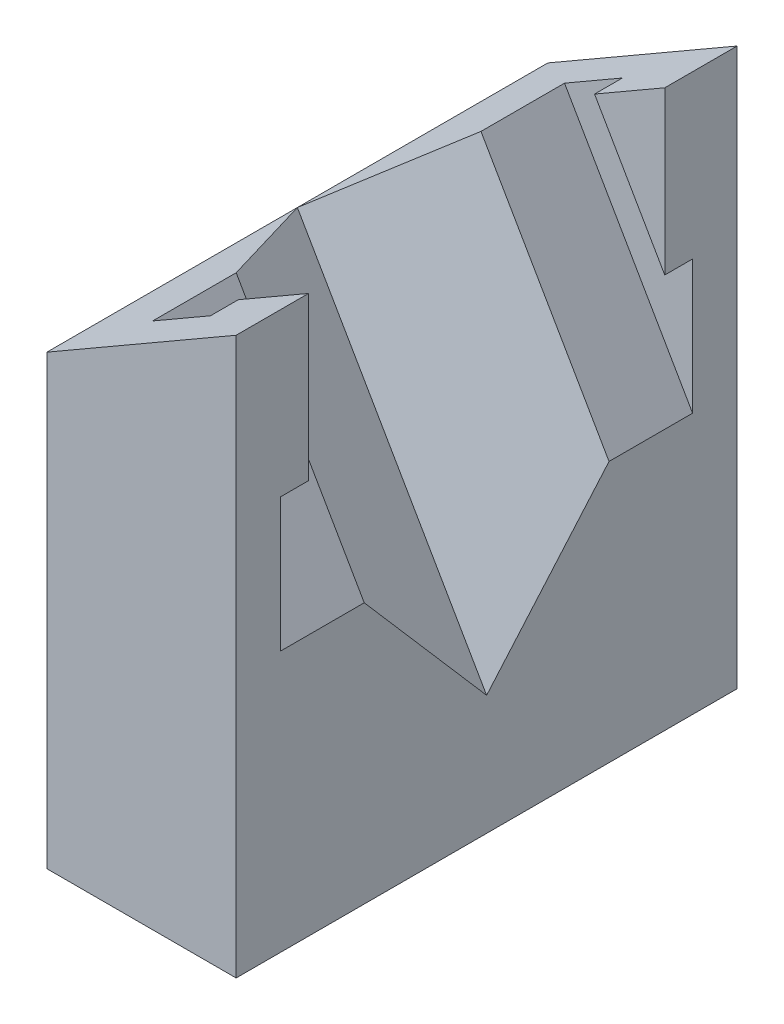
ISO-10303-21;
HEADER;
FILE_DESCRIPTION(('STEP AP214'),'2;1');
FILE_NAME('part.step','',(''),(''),'','','');
FILE_SCHEMA(('AUTOMOTIVE_DESIGN { 1 0 10303 214 1 1 1 1 }'));
ENDSEC;
DATA;
#1=APPLICATION_CONTEXT('core data for automotive mechanical design processes');
#2=APPLICATION_PROTOCOL_DEFINITION('international standard','automotive_design',2000,#1);
#3=PRODUCT_CONTEXT('',#1,'mechanical');
#4=PRODUCT('Part','Part','',(#3));
#5=PRODUCT_RELATED_PRODUCT_CATEGORY('part','',(#4));
#6=PRODUCT_DEFINITION_FORMATION('','',#4);
#7=PRODUCT_DEFINITION_CONTEXT('part definition',#1,'design');
#8=PRODUCT_DEFINITION('design','',#6,#7);
#9=PRODUCT_DEFINITION_SHAPE('','',#8);
#10=(LENGTH_UNIT() NAMED_UNIT(*) SI_UNIT(.MILLI.,.METRE.));
#11=(NAMED_UNIT(*) PLANE_ANGLE_UNIT() SI_UNIT($,.RADIAN.));
#12=(NAMED_UNIT(*) SI_UNIT($,.STERADIAN.) SOLID_ANGLE_UNIT());
#13=UNCERTAINTY_MEASURE_WITH_UNIT(LENGTH_MEASURE(1.E-05),#10,'distance_accuracy_value','');
#14=(GEOMETRIC_REPRESENTATION_CONTEXT(3) GLOBAL_UNCERTAINTY_ASSIGNED_CONTEXT((#13)) GLOBAL_UNIT_ASSIGNED_CONTEXT((#10,
#11,#12)) REPRESENTATION_CONTEXT('',''));
#15=CARTESIAN_POINT('',(0.,0.,0.));
#16=DIRECTION('',(0.,0.,1.));
#17=DIRECTION('',(1.,0.,0.));
#18=AXIS2_PLACEMENT_3D('',#15,#16,#17);
#19=CARTESIAN_POINT('',(8.5,50.,-22.5));
#20=DIRECTION('',(0.499999999999995,-0.866025403784442,0.));
#21=DIRECTION('',(0.866025403784442,0.499999999999995,0.));
#22=AXIS2_PLACEMENT_3D('',#19,#20,#21);
#23=PLANE('',#22);
#24=DIRECTION('',(0.,0.,-1.));
#25=VECTOR('',#24,1.);
#26=CARTESIAN_POINT('',(2.19333900576964,46.3588475772935,-18.5));
#27=LINE('',#26,#25);
#28=CARTESIAN_POINT('',(2.19333900576964,46.3588475772935,-16.));
#29=VERTEX_POINT('',#28);
#30=CARTESIAN_POINT('',(2.19333900576964,46.3588475772935,-18.5));
#31=VERTEX_POINT('',#30);
#32=EDGE_CURVE('E249',#29,#31,#27,.T.);
#33=ORIENTED_EDGE('',*,*,#32,.F.);
#34=DIRECTION('',(0.866025403784442,0.499999999999995,0.));
#35=VECTOR('',#34,1.);
#36=CARTESIAN_POINT('',(8.50000000000001,50.,-16.));
#37=LINE('',#36,#35);
#38=CARTESIAN_POINT('',(8.49999999999999,50.,-16.));
#39=VERTEX_POINT('',#38);
#40=EDGE_CURVE('E11',#29,#39,#37,.T.);
#41=ORIENTED_EDGE('',*,*,#40,.T.);
#42=DIRECTION('',(0.,0.,-1.));
#43=VECTOR('',#42,1.);
#44=CARTESIAN_POINT('',(8.5,50.,22.5));
#45=LINE('',#44,#43);
#46=CARTESIAN_POINT('',(8.5,50.,-22.5));
#47=VERTEX_POINT('',#46);
#48=EDGE_CURVE('E119',#39,#47,#45,.T.);
#49=ORIENTED_EDGE('',*,*,#48,.T.);
#50=DIRECTION('',(0.866025403784442,0.499999999999995,0.));
#51=VECTOR('',#50,1.);
#52=CARTESIAN_POINT('',(8.5,50.,-22.5));
#53=LINE('',#52,#51);
#54=CARTESIAN_POINT('',(-8.5,40.1850454237765,-22.5));
#55=VERTEX_POINT('',#54);
#56=EDGE_CURVE('E111',#55,#47,#53,.T.);
#57=ORIENTED_EDGE('',*,*,#56,.F.);
#58=DIRECTION('',(0.,0.,1.));
#59=VECTOR('',#58,1.);
#60=CARTESIAN_POINT('',(-8.5,40.1850454237765,-22.5));
#61=LINE('',#60,#59);
#62=CARTESIAN_POINT('',(-8.50000000000001,40.1850454237765,0.));
#63=VERTEX_POINT('',#62);
#64=EDGE_CURVE('E139',#55,#63,#61,.T.);
#65=ORIENTED_EDGE('',*,*,#64,.T.);
#66=DIRECTION('',(-0.433012701892222,-0.249999999999998,0.866025403784438));
#67=VECTOR('',#66,1.);
#68=CARTESIAN_POINT('',(-3.00281341693702,43.3588475772935,-10.9943731661259));
#69=LINE('',#68,#67);
#70=CARTESIAN_POINT('',(-3.00281341693702,43.3588475772935,-10.9943731661259));
#71=VERTEX_POINT('',#70);
#72=EDGE_CURVE('E237',#71,#63,#69,.T.);
#73=ORIENTED_EDGE('',*,*,#72,.F.);
#74=DIRECTION('',(0.,0.,1.));
#75=VECTOR('',#74,1.);
#76=CARTESIAN_POINT('',(-3.00281341693702,43.3588475772935,-18.5));
#77=LINE('',#76,#75);
#78=CARTESIAN_POINT('',(-3.00281341693702,43.3588475772935,-18.5));
#79=VERTEX_POINT('',#78);
#80=EDGE_CURVE('E241',#79,#71,#77,.T.);
#81=ORIENTED_EDGE('',*,*,#80,.F.);
#82=DIRECTION('',(-0.866025403784442,-0.499999999999994,0.));
#83=VECTOR('',#82,1.);
#84=CARTESIAN_POINT('',(2.19333900576964,46.3588475772935,-18.5));
#85=LINE('',#84,#83);
#86=EDGE_CURVE('E245',#31,#79,#85,.T.);
#87=ORIENTED_EDGE('',*,*,#86,.F.);
#88=EDGE_LOOP('',(#33,#41,#49,#57,#65,#73,#81,#87));
#89=FACE_BOUND('',#88,.T.);
#90=ADVANCED_FACE('F45',(#89),#23,.F.);
#91=CARTESIAN_POINT('',(-8.5,50.,22.5));
#92=DIRECTION('',(1.,0.,0.));
#93=DIRECTION('',(0.,0.,-1.));
#94=AXIS2_PLACEMENT_3D('',#91,#92,#93);
#95=PLANE('',#94);
#96=DIRECTION('',(0.,-1.,0.));
#97=VECTOR('',#96,1.);
#98=CARTESIAN_POINT('',(-8.5,50.,22.5));
#99=LINE('',#98,#97);
#100=CARTESIAN_POINT('',(-8.5,40.1850454237765,22.5));
#101=VERTEX_POINT('',#100);
#102=CARTESIAN_POINT('',(-8.5,0.,22.5));
#103=VERTEX_POINT('',#102);
#104=EDGE_CURVE('E54',#101,#103,#99,.T.);
#105=ORIENTED_EDGE('',*,*,#104,.F.);
#106=EDGE_CURVE('E143',#63,#101,#61,.T.);
#107=ORIENTED_EDGE('',*,*,#106,.F.);
#108=ORIENTED_EDGE('',*,*,#64,.F.);
#109=DIRECTION('',(0.,-1.,0.));
#110=VECTOR('',#109,1.);
#111=CARTESIAN_POINT('',(-8.5,50.,-22.5));
#112=LINE('',#111,#110);
#113=CARTESIAN_POINT('',(-8.5,0.,-22.5));
#114=VERTEX_POINT('',#113);
#115=EDGE_CURVE('E113',#55,#114,#112,.T.);
#116=ORIENTED_EDGE('',*,*,#115,.T.);
#117=DIRECTION('',(0.,0.,1.));
#118=VECTOR('',#117,1.);
#119=CARTESIAN_POINT('',(-8.5,0.,22.5));
#120=LINE('',#119,#118);
#121=EDGE_CURVE('E117',#114,#103,#120,.T.);
#122=ORIENTED_EDGE('',*,*,#121,.T.);
#123=EDGE_LOOP('',(#105,#107,#108,#116,#122));
#124=FACE_BOUND('',#123,.T.);
#125=ADVANCED_FACE('F47',(#124),#95,.F.);
#126=CARTESIAN_POINT('',(8.5,50.,22.5));
#127=DIRECTION('',(0.,0.,-1.));
#128=DIRECTION('',(-1.,0.,0.));
#129=AXIS2_PLACEMENT_3D('',#126,#127,#128);
#130=PLANE('',#129);
#131=DIRECTION('',(0.,-1.,0.));
#132=VECTOR('',#131,1.);
#133=CARTESIAN_POINT('',(8.5,50.,22.5));
#134=LINE('',#133,#132);
#135=CARTESIAN_POINT('',(8.5,50.,22.5));
#136=VERTEX_POINT('',#135);
#137=CARTESIAN_POINT('',(8.5,0.,22.5));
#138=VERTEX_POINT('',#137);
#139=EDGE_CURVE('E96',#136,#138,#134,.T.);
#140=ORIENTED_EDGE('',*,*,#139,.F.);
#141=DIRECTION('',(0.866025403784442,0.499999999999995,0.));
#142=VECTOR('',#141,1.);
#143=CARTESIAN_POINT('',(8.5,50.,22.5));
#144=LINE('',#143,#142);
#145=EDGE_CURVE('E70',#101,#136,#144,.T.);
#146=ORIENTED_EDGE('',*,*,#145,.F.);
#147=ORIENTED_EDGE('',*,*,#104,.T.);
#148=DIRECTION('',(1.,0.,0.));
#149=VECTOR('',#148,1.);
#150=CARTESIAN_POINT('',(8.5,0.,22.5));
#151=LINE('',#150,#149);
#152=EDGE_CURVE('E102',#103,#138,#151,.T.);
#153=ORIENTED_EDGE('',*,*,#152,.T.);
#154=EDGE_LOOP('',(#140,#146,#147,#153));
#155=FACE_BOUND('',#154,.T.);
#156=ADVANCED_FACE('F133',(#155),#130,.F.);
#157=CARTESIAN_POINT('',(8.5,50.,22.5));
#158=DIRECTION('',(-1.,0.,0.));
#159=DIRECTION('',(0.,0.,1.));
#160=AXIS2_PLACEMENT_3D('',#157,#158,#159);
#161=PLANE('',#160);
#162=ORIENTED_EDGE('',*,*,#48,.F.);
#163=DIRECTION('',(0.,-1.,0.));
#164=VECTOR('',#163,1.);
#165=CARTESIAN_POINT('',(8.5,50.,-16.));
#166=LINE('',#165,#164);
#167=CARTESIAN_POINT('',(8.5,35.4353903091735,-16.));
#168=VERTEX_POINT('',#167);
#169=EDGE_CURVE('E183',#39,#168,#166,.T.);
#170=ORIENTED_EDGE('',*,*,#169,.T.);
#171=DIRECTION('',(0.,0.,-1.));
#172=VECTOR('',#171,1.);
#173=CARTESIAN_POINT('',(8.5,35.4353903091735,22.5));
#174=LINE('',#173,#172);
#175=CARTESIAN_POINT('',(8.5,35.4353903091735,-18.5));
#176=VERTEX_POINT('',#175);
#177=EDGE_CURVE('E179',#168,#176,#174,.T.);
#178=ORIENTED_EDGE('',*,*,#177,.T.);
#179=DIRECTION('',(0.,-1.,0.));
#180=VECTOR('',#179,1.);
#181=CARTESIAN_POINT('',(8.5,50.,-18.5));
#182=LINE('',#181,#180);
#183=CARTESIAN_POINT('',(8.5,23.4353903091733,-18.5));
#184=VERTEX_POINT('',#183);
#185=EDGE_CURVE('E175',#176,#184,#182,.T.);
#186=ORIENTED_EDGE('',*,*,#185,.T.);
#187=DIRECTION('',(0.,0.,1.));
#188=VECTOR('',#187,1.);
#189=CARTESIAN_POINT('',(8.5,23.4353903091733,22.5));
#190=LINE('',#189,#188);
#191=CARTESIAN_POINT('',(8.5,23.4353903091733,-10.9943731661259));
#192=VERTEX_POINT('',#191);
#193=EDGE_CURVE('E171',#184,#192,#190,.T.);
#194=ORIENTED_EDGE('',*,*,#193,.T.);
#195=DIRECTION('',(0.,-0.755928946018459,0.654653670707972));
#196=VECTOR('',#195,1.);
#197=CARTESIAN_POINT('',(8.5,22.0397512492454,-9.78571428571453));
#198=LINE('',#197,#196);
#199=CARTESIAN_POINT('',(8.5,10.7401816951052,0.));
#200=VERTEX_POINT('',#199);
#201=EDGE_CURVE('E167',#192,#200,#198,.T.);
#202=ORIENTED_EDGE('',*,*,#201,.T.);
#203=DIRECTION('',(0.,0.755928946018458,0.654653670707973));
#204=VECTOR('',#203,1.);
#205=CARTESIAN_POINT('',(8.5,44.3089759179881,29.0714285714285));
#206=LINE('',#205,#204);
#207=CARTESIAN_POINT('',(8.5,23.4353903091733,10.9943731661259));
#208=VERTEX_POINT('',#207);
#209=EDGE_CURVE('E163',#200,#208,#206,.T.);
#210=ORIENTED_EDGE('',*,*,#209,.T.);
#211=DIRECTION('',(0.,0.,1.));
#212=VECTOR('',#211,1.);
#213=CARTESIAN_POINT('',(8.5,23.4353903091733,22.5));
#214=LINE('',#213,#212);
#215=CARTESIAN_POINT('',(8.5,23.4353903091733,18.5));
#216=VERTEX_POINT('',#215);
#217=EDGE_CURVE('E159',#208,#216,#214,.T.);
#218=ORIENTED_EDGE('',*,*,#217,.T.);
#219=DIRECTION('',(0.,1.,0.));
#220=VECTOR('',#219,1.);
#221=CARTESIAN_POINT('',(8.5,50.,18.5));
#222=LINE('',#221,#220);
#223=CARTESIAN_POINT('',(8.5,35.4353903091735,18.5));
#224=VERTEX_POINT('',#223);
#225=EDGE_CURVE('E155',#216,#224,#222,.T.);
#226=ORIENTED_EDGE('',*,*,#225,.T.);
#227=DIRECTION('',(0.,0.,-1.));
#228=VECTOR('',#227,1.);
#229=CARTESIAN_POINT('',(8.5,35.4353903091735,22.5));
#230=LINE('',#229,#228);
#231=CARTESIAN_POINT('',(8.5,35.4353903091735,16.));
#232=VERTEX_POINT('',#231);
#233=EDGE_CURVE('E149',#224,#232,#230,.T.);
#234=ORIENTED_EDGE('',*,*,#233,.T.);
#235=DIRECTION('',(0.,1.,0.));
#236=VECTOR('',#235,1.);
#237=CARTESIAN_POINT('',(8.5,50.,16.));
#238=LINE('',#237,#236);
#239=CARTESIAN_POINT('',(8.49999999999999,50.,16.));
#240=VERTEX_POINT('',#239);
#241=EDGE_CURVE('E187',#232,#240,#238,.T.);
#242=ORIENTED_EDGE('',*,*,#241,.T.);
#243=EDGE_CURVE('E123',#136,#240,#45,.T.);
#244=ORIENTED_EDGE('',*,*,#243,.F.);
#245=ORIENTED_EDGE('',*,*,#139,.T.);
#246=DIRECTION('',(0.,0.,-1.));
#247=VECTOR('',#246,1.);
#248=CARTESIAN_POINT('',(8.5,0.,22.5));
#249=LINE('',#248,#247);
#250=CARTESIAN_POINT('',(8.5,0.,-22.5));
#251=VERTEX_POINT('',#250);
#252=EDGE_CURVE('E90',#138,#251,#249,.T.);
#253=ORIENTED_EDGE('',*,*,#252,.T.);
#254=DIRECTION('',(0.,-1.,0.));
#255=VECTOR('',#254,1.);
#256=CARTESIAN_POINT('',(8.5,50.,-22.5));
#257=LINE('',#256,#255);
#258=EDGE_CURVE('E94',#47,#251,#257,.T.);
#259=ORIENTED_EDGE('',*,*,#258,.F.);
#260=EDGE_LOOP('',(#162,#170,#178,#186,#194,#202,#210,#218,#226,#234,#242,#244,#245,#253,#259));
#261=FACE_BOUND('',#260,.T.);
#262=ADVANCED_FACE('F93',(#261),#161,.F.);
#263=CARTESIAN_POINT('',(8.5,50.,-22.5));
#264=DIRECTION('',(0.,0.,1.));
#265=DIRECTION('',(1.,0.,0.));
#266=AXIS2_PLACEMENT_3D('',#263,#264,#265);
#267=PLANE('',#266);
#268=ORIENTED_EDGE('',*,*,#115,.F.);
#269=ORIENTED_EDGE('',*,*,#56,.T.);
#270=ORIENTED_EDGE('',*,*,#258,.T.);
#271=DIRECTION('',(-1.,0.,0.));
#272=VECTOR('',#271,1.);
#273=CARTESIAN_POINT('',(8.5,0.,-22.5));
#274=LINE('',#273,#272);
#275=EDGE_CURVE('E101',#251,#114,#274,.T.);
#276=ORIENTED_EDGE('',*,*,#275,.T.);
#277=EDGE_LOOP('',(#268,#269,#270,#276));
#278=FACE_BOUND('',#277,.T.);
#279=ADVANCED_FACE('F108',(#278),#267,.F.);
#280=CARTESIAN_POINT('',(0.,0.,0.));
#281=DIRECTION('',(0.,1.,0.));
#282=DIRECTION('',(0.,0.,1.));
#283=AXIS2_PLACEMENT_3D('',#280,#281,#282);
#284=PLANE('',#283);
#285=ORIENTED_EDGE('',*,*,#121,.F.);
#286=ORIENTED_EDGE('',*,*,#275,.F.);
#287=ORIENTED_EDGE('',*,*,#252,.F.);
#288=ORIENTED_EDGE('',*,*,#152,.F.);
#289=EDGE_LOOP('',(#285,#286,#287,#288));
#290=FACE_BOUND('',#289,.T.);
#291=ADVANCED_FACE('F115',(#290),#284,.F.);
#292=DIRECTION('',(0.,0.,1.));
#293=VECTOR('',#292,1.);
#294=CARTESIAN_POINT('',(-3.00281341693702,43.3588475772935,18.5));
#295=LINE('',#294,#293);
#296=CARTESIAN_POINT('',(-3.00281341693702,43.3588475772935,10.9943731661259));
#297=VERTEX_POINT('',#296);
#298=CARTESIAN_POINT('',(-3.00281341693702,43.3588475772935,18.5));
#299=VERTEX_POINT('',#298);
#300=EDGE_CURVE('E229',#297,#299,#295,.T.);
#301=ORIENTED_EDGE('',*,*,#300,.F.);
#302=DIRECTION('',(0.433012701892221,0.249999999999998,0.866025403784438));
#303=VECTOR('',#302,1.);
#304=CARTESIAN_POINT('',(-8.50000000000001,40.1850454237765,0.));
#305=LINE('',#304,#303);
#306=EDGE_CURVE('E233',#63,#297,#305,.T.);
#307=ORIENTED_EDGE('',*,*,#306,.F.);
#308=ORIENTED_EDGE('',*,*,#106,.T.);
#309=ORIENTED_EDGE('',*,*,#145,.T.);
#310=ORIENTED_EDGE('',*,*,#243,.T.);
#311=DIRECTION('',(0.866025403784442,0.499999999999995,0.));
#312=VECTOR('',#311,1.);
#313=CARTESIAN_POINT('',(2.19333900576964,46.3588475772935,16.));
#314=LINE('',#313,#312);
#315=CARTESIAN_POINT('',(2.19333900576964,46.3588475772934,16.));
#316=VERTEX_POINT('',#315);
#317=EDGE_CURVE('E253',#316,#240,#314,.T.);
#318=ORIENTED_EDGE('',*,*,#317,.F.);
#319=DIRECTION('',(0.,0.,-1.));
#320=VECTOR('',#319,1.);
#321=CARTESIAN_POINT('',(2.19333900576964,46.3588475772935,18.5));
#322=LINE('',#321,#320);
#323=CARTESIAN_POINT('',(2.19333900576964,46.3588475772935,18.5));
#324=VERTEX_POINT('',#323);
#325=EDGE_CURVE('E61',#324,#316,#322,.T.);
#326=ORIENTED_EDGE('',*,*,#325,.F.);
#327=DIRECTION('',(0.866025403784442,0.499999999999994,0.));
#328=VECTOR('',#327,1.);
#329=CARTESIAN_POINT('',(2.19333900576964,46.3588475772935,18.5));
#330=LINE('',#329,#328);
#331=EDGE_CURVE('E196',#299,#324,#330,.T.);
#332=ORIENTED_EDGE('',*,*,#331,.F.);
#333=EDGE_LOOP('',(#301,#307,#308,#309,#310,#318,#326,#332));
#334=FACE_BOUND('',#333,.T.);
#335=ADVANCED_FACE('F261',(#334),#23,.F.);
#336=CARTESIAN_POINT('',(23.8439741003805,8.85884757729317,18.5));
#337=DIRECTION('',(0.866025403784442,0.499999999999995,0.));
#338=DIRECTION('',(-0.499999999999995,0.866025403784442,0.));
#339=AXIS2_PLACEMENT_3D('',#336,#337,#338);
#340=PLANE('',#339);
#341=DIRECTION('',(-0.499999999999995,0.866025403784442,0.));
#342=VECTOR('',#341,1.);
#343=CARTESIAN_POINT('',(23.8439741003805,8.85884757729317,18.5));
#344=LINE('',#343,#342);
#345=EDGE_CURVE('E191',#224,#324,#344,.T.);
#346=ORIENTED_EDGE('',*,*,#345,.T.);
#347=ORIENTED_EDGE('',*,*,#325,.T.);
#348=DIRECTION('',(-0.499999999999995,0.866025403784442,0.));
#349=VECTOR('',#348,1.);
#350=CARTESIAN_POINT('',(23.8439741003805,8.85884757729317,16.));
#351=LINE('',#350,#349);
#352=EDGE_CURVE('E192',#232,#316,#351,.T.);
#353=ORIENTED_EDGE('',*,*,#352,.F.);
#354=ORIENTED_EDGE('',*,*,#233,.F.);
#355=EDGE_LOOP('',(#346,#347,#353,#354));
#356=FACE_BOUND('',#355,.T.);
#357=ADVANCED_FACE('F343',(#356),#340,.F.);
#358=CARTESIAN_POINT('',(23.8439741003805,8.85884757729317,18.5));
#359=DIRECTION('',(0.,0.,1.));
#360=DIRECTION('',(1.,0.,0.));
#361=AXIS2_PLACEMENT_3D('',#358,#359,#360);
#362=PLANE('',#361);
#363=DIRECTION('',(-0.499999999999995,0.866025403784442,0.));
#364=VECTOR('',#363,1.);
#365=CARTESIAN_POINT('',(18.6478216776738,5.85884757729321,18.5));
#366=LINE('',#365,#364);
#367=EDGE_CURVE('E220',#216,#299,#366,.T.);
#368=ORIENTED_EDGE('',*,*,#367,.T.);
#369=ORIENTED_EDGE('',*,*,#331,.T.);
#370=ORIENTED_EDGE('',*,*,#345,.F.);
#371=ORIENTED_EDGE('',*,*,#225,.F.);
#372=EDGE_LOOP('',(#368,#369,#370,#371));
#373=FACE_BOUND('',#372,.T.);
#374=ADVANCED_FACE('F341',(#373),#362,.F.);
#375=CARTESIAN_POINT('',(18.6478216776738,5.85884757729321,18.5));
#376=DIRECTION('',(-0.866025403784442,-0.499999999999995,0.));
#377=DIRECTION('',(0.499999999999995,-0.866025403784442,0.));
#378=AXIS2_PLACEMENT_3D('',#375,#376,#377);
#379=PLANE('',#378);
#380=DIRECTION('',(-0.499999999999995,0.866025403784442,0.));
#381=VECTOR('',#380,1.);
#382=CARTESIAN_POINT('',(18.6478216776738,5.85884757729321,10.9943731661259));
#383=LINE('',#382,#381);
#384=EDGE_CURVE('E216',#208,#297,#383,.T.);
#385=ORIENTED_EDGE('',*,*,#384,.T.);
#386=ORIENTED_EDGE('',*,*,#300,.T.);
#387=ORIENTED_EDGE('',*,*,#367,.F.);
#388=ORIENTED_EDGE('',*,*,#217,.F.);
#389=EDGE_LOOP('',(#385,#386,#387,#388));
#390=FACE_BOUND('',#389,.T.);
#391=ADVANCED_FACE('F338',(#390),#379,.F.);
#392=CARTESIAN_POINT('',(13.1506350946108,2.68504542377623,0.));
#393=DIRECTION('',(-0.750000000000002,-0.433012701892215,0.5));
#394=DIRECTION('',(0.554700196225228,0.,0.832050294337844));
#395=AXIS2_PLACEMENT_3D('',#392,#393,#394);
#396=PLANE('',#395);
#397=DIRECTION('',(-0.499999999999995,0.866025403784442,0.));
#398=VECTOR('',#397,1.);
#399=CARTESIAN_POINT('',(13.1506350946108,2.68504542377623,0.));
#400=LINE('',#399,#398);
#401=EDGE_CURVE('E212',#200,#63,#400,.T.);
#402=ORIENTED_EDGE('',*,*,#401,.T.);
#403=ORIENTED_EDGE('',*,*,#306,.T.);
#404=ORIENTED_EDGE('',*,*,#384,.F.);
#405=ORIENTED_EDGE('',*,*,#209,.F.);
#406=EDGE_LOOP('',(#402,#403,#404,#405));
#407=FACE_BOUND('',#406,.T.);
#408=ADVANCED_FACE('F334',(#407),#396,.F.);
#409=CARTESIAN_POINT('',(18.6478216776738,5.85884757729321,-10.9943731661259));
#410=DIRECTION('',(-0.750000000000002,-0.433012701892215,-0.500000000000001));
#411=DIRECTION('',(-0.554700196225229,0.,0.832050294337844));
#412=AXIS2_PLACEMENT_3D('',#409,#410,#411);
#413=PLANE('',#412);
#414=DIRECTION('',(-0.499999999999995,0.866025403784442,0.));
#415=VECTOR('',#414,1.);
#416=CARTESIAN_POINT('',(18.6478216776738,5.85884757729321,-10.9943731661259));
#417=LINE('',#416,#415);
#418=EDGE_CURVE('E208',#192,#71,#417,.T.);
#419=ORIENTED_EDGE('',*,*,#418,.T.);
#420=ORIENTED_EDGE('',*,*,#72,.T.);
#421=ORIENTED_EDGE('',*,*,#401,.F.);
#422=ORIENTED_EDGE('',*,*,#201,.F.);
#423=EDGE_LOOP('',(#419,#420,#421,#422));
#424=FACE_BOUND('',#423,.T.);
#425=ADVANCED_FACE('F331',(#424),#413,.F.);
#426=CARTESIAN_POINT('',(18.6478216776738,5.85884757729321,-18.5));
#427=DIRECTION('',(-0.866025403784442,-0.499999999999995,0.));
#428=DIRECTION('',(0.499999999999995,-0.866025403784442,0.));
#429=AXIS2_PLACEMENT_3D('',#426,#427,#428);
#430=PLANE('',#429);
#431=DIRECTION('',(-0.499999999999995,0.866025403784442,0.));
#432=VECTOR('',#431,1.);
#433=CARTESIAN_POINT('',(18.6478216776738,5.85884757729321,-18.5));
#434=LINE('',#433,#432);
#435=EDGE_CURVE('E204',#184,#79,#434,.T.);
#436=ORIENTED_EDGE('',*,*,#435,.T.);
#437=ORIENTED_EDGE('',*,*,#80,.T.);
#438=ORIENTED_EDGE('',*,*,#418,.F.);
#439=ORIENTED_EDGE('',*,*,#193,.F.);
#440=EDGE_LOOP('',(#436,#437,#438,#439));
#441=FACE_BOUND('',#440,.T.);
#442=ADVANCED_FACE('F329',(#441),#430,.F.);
#443=CARTESIAN_POINT('',(23.8439741003805,8.85884757729317,-18.5));
#444=DIRECTION('',(0.,0.,-1.));
#445=DIRECTION('',(-1.,0.,0.));
#446=AXIS2_PLACEMENT_3D('',#443,#444,#445);
#447=PLANE('',#446);
#448=DIRECTION('',(-0.499999999999995,0.866025403784442,0.));
#449=VECTOR('',#448,1.);
#450=CARTESIAN_POINT('',(23.8439741003805,8.85884757729317,-18.5));
#451=LINE('',#450,#449);
#452=EDGE_CURVE('E200',#176,#31,#451,.T.);
#453=ORIENTED_EDGE('',*,*,#452,.T.);
#454=ORIENTED_EDGE('',*,*,#86,.T.);
#455=ORIENTED_EDGE('',*,*,#435,.F.);
#456=ORIENTED_EDGE('',*,*,#185,.F.);
#457=EDGE_LOOP('',(#453,#454,#455,#456));
#458=FACE_BOUND('',#457,.T.);
#459=ADVANCED_FACE('F326',(#458),#447,.F.);
#460=CARTESIAN_POINT('',(23.8439741003805,8.85884757729317,-18.5));
#461=DIRECTION('',(0.866025403784442,0.499999999999995,0.));
#462=DIRECTION('',(-0.499999999999995,0.866025403784442,0.));
#463=AXIS2_PLACEMENT_3D('',#460,#461,#462);
#464=PLANE('',#463);
#465=DIRECTION('',(-0.499999999999995,0.866025403784442,0.));
#466=VECTOR('',#465,1.);
#467=CARTESIAN_POINT('',(23.8439741003805,8.85884757729317,-16.));
#468=LINE('',#467,#466);
#469=EDGE_CURVE('E195',#168,#29,#468,.T.);
#470=ORIENTED_EDGE('',*,*,#469,.T.);
#471=ORIENTED_EDGE('',*,*,#32,.T.);
#472=ORIENTED_EDGE('',*,*,#452,.F.);
#473=ORIENTED_EDGE('',*,*,#177,.F.);
#474=EDGE_LOOP('',(#470,#471,#472,#473));
#475=FACE_BOUND('',#474,.T.);
#476=ADVANCED_FACE('F319',(#475),#464,.F.);
#477=CARTESIAN_POINT('',(37.1506350946109,16.5414518843271,-16.));
#478=DIRECTION('',(0.,0.,-1.));
#479=DIRECTION('',(-1.,0.,0.));
#480=AXIS2_PLACEMENT_3D('',#477,#478,#479);
#481=PLANE('',#480);
#482=ORIENTED_EDGE('',*,*,#40,.F.);
#483=ORIENTED_EDGE('',*,*,#469,.F.);
#484=ORIENTED_EDGE('',*,*,#169,.F.);
#485=EDGE_LOOP('',(#482,#483,#484));
#486=FACE_BOUND('',#485,.T.);
#487=ADVANCED_FACE('F323',(#486),#481,.F.);
#488=CARTESIAN_POINT('',(23.8439741003805,8.85884757729317,16.));
#489=DIRECTION('',(0.,0.,1.));
#490=DIRECTION('',(1.,0.,0.));
#491=AXIS2_PLACEMENT_3D('',#488,#489,#490);
#492=PLANE('',#491);
#493=ORIENTED_EDGE('',*,*,#352,.T.);
#494=ORIENTED_EDGE('',*,*,#317,.T.);
#495=ORIENTED_EDGE('',*,*,#241,.F.);
#496=EDGE_LOOP('',(#493,#494,#495));
#497=FACE_BOUND('',#496,.T.);
#498=ADVANCED_FACE('F346',(#497),#492,.F.);
#499=CLOSED_SHELL('',(#90,#125,#156,#262,#279,#291,#335,#357,#374,#391,#408,#425,#442,#459,#476,
#487,#498));
#500=MANIFOLD_SOLID_BREP('B2',#499);
#501=ADVANCED_BREP_SHAPE_REPRESENTATION('',(#18,#500),#14);
#502=SHAPE_DEFINITION_REPRESENTATION(#9,#501);
ENDSEC;
END-ISO-10303-21;
